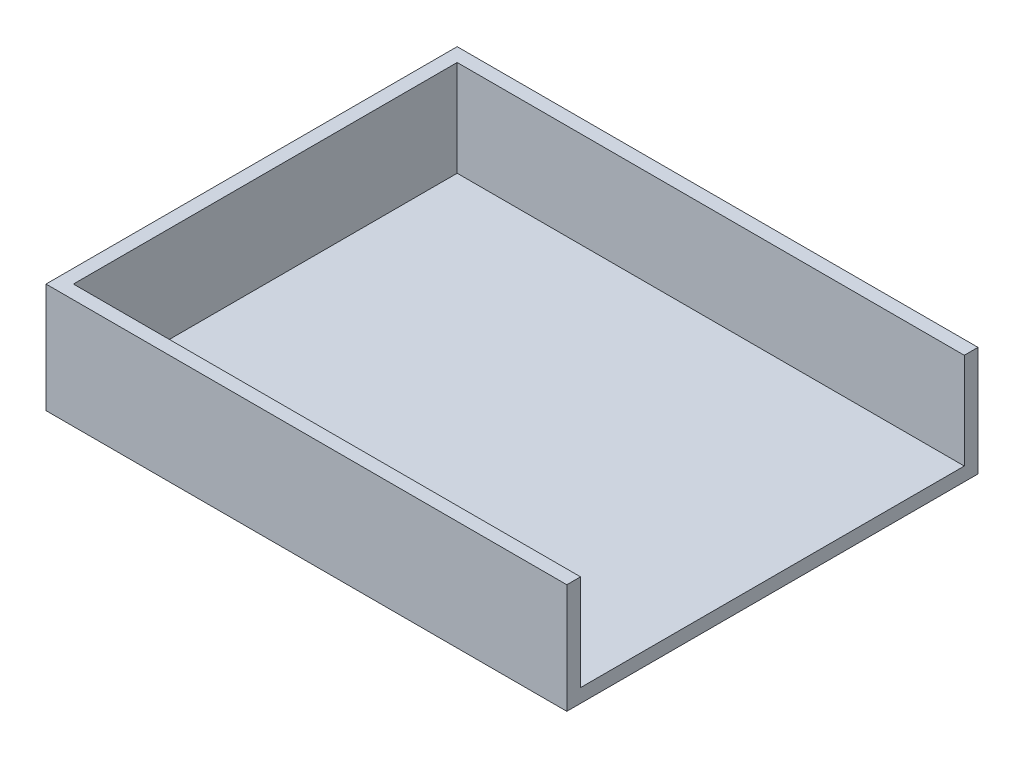
ISO-10303-21;
HEADER;
FILE_DESCRIPTION(('STEP AP214'),'2;1');
FILE_NAME('part.step','',(''),(''),'','','');
FILE_SCHEMA(('AUTOMOTIVE_DESIGN { 1 0 10303 214 1 1 1 1 }'));
ENDSEC;
DATA;
#1=APPLICATION_CONTEXT('core data for automotive mechanical design processes');
#2=APPLICATION_PROTOCOL_DEFINITION('international standard','automotive_design',2000,#1);
#3=PRODUCT_CONTEXT('',#1,'mechanical');
#4=PRODUCT('Part','Part','',(#3));
#5=PRODUCT_RELATED_PRODUCT_CATEGORY('part','',(#4));
#6=PRODUCT_DEFINITION_FORMATION('','',#4);
#7=PRODUCT_DEFINITION_CONTEXT('part definition',#1,'design');
#8=PRODUCT_DEFINITION('design','',#6,#7);
#9=PRODUCT_DEFINITION_SHAPE('','',#8);
#10=(LENGTH_UNIT() NAMED_UNIT(*) SI_UNIT(.MILLI.,.METRE.));
#11=(NAMED_UNIT(*) PLANE_ANGLE_UNIT() SI_UNIT($,.RADIAN.));
#12=(NAMED_UNIT(*) SI_UNIT($,.STERADIAN.) SOLID_ANGLE_UNIT());
#13=UNCERTAINTY_MEASURE_WITH_UNIT(LENGTH_MEASURE(1.E-05),#10,'distance_accuracy_value','');
#14=(GEOMETRIC_REPRESENTATION_CONTEXT(3) GLOBAL_UNCERTAINTY_ASSIGNED_CONTEXT((#13)) GLOBAL_UNIT_ASSIGNED_CONTEXT((#10,
#11,#12)) REPRESENTATION_CONTEXT('',''));
#15=CARTESIAN_POINT('',(0.,0.,0.));
#16=DIRECTION('',(0.,0.,1.));
#17=DIRECTION('',(1.,0.,0.));
#18=AXIS2_PLACEMENT_3D('',#15,#16,#17);
#19=CARTESIAN_POINT('',(19.,8.,15.));
#20=DIRECTION('',(-1.,0.,0.));
#21=DIRECTION('',(0.,0.,1.));
#22=AXIS2_PLACEMENT_3D('',#19,#20,#21);
#23=PLANE('',#22);
#24=DIRECTION('',(0.,-1.,0.));
#25=VECTOR('',#24,1.);
#26=CARTESIAN_POINT('',(19.,8.,14.));
#27=LINE('',#26,#25);
#28=CARTESIAN_POINT('',(19.,8.,14.));
#29=VERTEX_POINT('',#28);
#30=CARTESIAN_POINT('',(19.,1.,14.));
#31=VERTEX_POINT('',#30);
#32=EDGE_CURVE('E127',#29,#31,#27,.T.);
#33=ORIENTED_EDGE('',*,*,#32,.F.);
#34=DIRECTION('',(0.,0.,-1.));
#35=VECTOR('',#34,1.);
#36=CARTESIAN_POINT('',(19.,8.,15.));
#37=LINE('',#36,#35);
#38=CARTESIAN_POINT('',(19.,8.,15.));
#39=VERTEX_POINT('',#38);
#40=EDGE_CURVE('E132',#39,#29,#37,.T.);
#41=ORIENTED_EDGE('',*,*,#40,.F.);
#42=DIRECTION('',(0.,-1.,0.));
#43=VECTOR('',#42,1.);
#44=CARTESIAN_POINT('',(19.,8.,15.));
#45=LINE('',#44,#43);
#46=CARTESIAN_POINT('',(19.,0.,15.));
#47=VERTEX_POINT('',#46);
#48=EDGE_CURVE('E41',#39,#47,#45,.T.);
#49=ORIENTED_EDGE('',*,*,#48,.T.);
#50=DIRECTION('',(0.,0.,-1.));
#51=VECTOR('',#50,1.);
#52=CARTESIAN_POINT('',(19.,0.,15.));
#53=LINE('',#52,#51);
#54=CARTESIAN_POINT('',(19.,0.,-15.));
#55=VERTEX_POINT('',#54);
#56=EDGE_CURVE('E157',#47,#55,#53,.T.);
#57=ORIENTED_EDGE('',*,*,#56,.T.);
#58=DIRECTION('',(0.,-1.,0.));
#59=VECTOR('',#58,1.);
#60=CARTESIAN_POINT('',(19.,8.,-15.));
#61=LINE('',#60,#59);
#62=CARTESIAN_POINT('',(19.,8.,-15.));
#63=VERTEX_POINT('',#62);
#64=EDGE_CURVE('E161',#63,#55,#61,.T.);
#65=ORIENTED_EDGE('',*,*,#64,.F.);
#66=CARTESIAN_POINT('',(19.,8.,-14.));
#67=VERTEX_POINT('',#66);
#68=EDGE_CURVE('E149',#67,#63,#37,.T.);
#69=ORIENTED_EDGE('',*,*,#68,.F.);
#70=DIRECTION('',(0.,-1.,0.));
#71=VECTOR('',#70,1.);
#72=CARTESIAN_POINT('',(19.,8.,-14.));
#73=LINE('',#72,#71);
#74=CARTESIAN_POINT('',(19.,1.,-14.));
#75=VERTEX_POINT('',#74);
#76=EDGE_CURVE('E48',#67,#75,#73,.T.);
#77=ORIENTED_EDGE('',*,*,#76,.T.);
#78=DIRECTION('',(0.,0.,-1.));
#79=VECTOR('',#78,1.);
#80=CARTESIAN_POINT('',(19.,1.,-14.));
#81=LINE('',#80,#79);
#82=EDGE_CURVE('E140',#31,#75,#81,.T.);
#83=ORIENTED_EDGE('',*,*,#82,.F.);
#84=EDGE_LOOP('',(#33,#41,#49,#57,#65,#69,#77,#83));
#85=FACE_BOUND('',#84,.T.);
#86=ADVANCED_FACE('F33',(#85),#23,.F.);
#87=CARTESIAN_POINT('',(0.,8.,0.));
#88=DIRECTION('',(0.,1.,0.));
#89=DIRECTION('',(0.,0.,1.));
#90=AXIS2_PLACEMENT_3D('',#87,#88,#89);
#91=PLANE('',#90);
#92=ORIENTED_EDGE('',*,*,#40,.T.);
#93=DIRECTION('',(1.,0.,0.));
#94=VECTOR('',#93,1.);
#95=CARTESIAN_POINT('',(-18.,8.,14.));
#96=LINE('',#95,#94);
#97=CARTESIAN_POINT('',(-18.,8.,14.));
#98=VERTEX_POINT('',#97);
#99=EDGE_CURVE('E118',#98,#29,#96,.T.);
#100=ORIENTED_EDGE('',*,*,#99,.F.);
#101=DIRECTION('',(0.,0.,1.));
#102=VECTOR('',#101,1.);
#103=CARTESIAN_POINT('',(-18.,8.,-14.));
#104=LINE('',#103,#102);
#105=CARTESIAN_POINT('',(-18.,8.,-14.));
#106=VERTEX_POINT('',#105);
#107=EDGE_CURVE('E109',#106,#98,#104,.T.);
#108=ORIENTED_EDGE('',*,*,#107,.F.);
#109=DIRECTION('',(-1.,0.,0.));
#110=VECTOR('',#109,1.);
#111=CARTESIAN_POINT('',(-18.,8.,-14.));
#112=LINE('',#111,#110);
#113=EDGE_CURVE('E133',#67,#106,#112,.T.);
#114=ORIENTED_EDGE('',*,*,#113,.F.);
#115=ORIENTED_EDGE('',*,*,#68,.T.);
#116=DIRECTION('',(-1.,0.,0.));
#117=VECTOR('',#116,1.);
#118=CARTESIAN_POINT('',(19.,8.,-15.));
#119=LINE('',#118,#117);
#120=CARTESIAN_POINT('',(-19.,8.,-15.));
#121=VERTEX_POINT('',#120);
#122=EDGE_CURVE('E57',#63,#121,#119,.T.);
#123=ORIENTED_EDGE('',*,*,#122,.T.);
#124=DIRECTION('',(0.,0.,1.));
#125=VECTOR('',#124,1.);
#126=CARTESIAN_POINT('',(-19.,8.,15.));
#127=LINE('',#126,#125);
#128=CARTESIAN_POINT('',(-19.,8.,15.));
#129=VERTEX_POINT('',#128);
#130=EDGE_CURVE('E146',#121,#129,#127,.T.);
#131=ORIENTED_EDGE('',*,*,#130,.T.);
#132=DIRECTION('',(1.,0.,0.));
#133=VECTOR('',#132,1.);
#134=CARTESIAN_POINT('',(19.,8.,15.));
#135=LINE('',#134,#133);
#136=EDGE_CURVE('E85',#129,#39,#135,.T.);
#137=ORIENTED_EDGE('',*,*,#136,.T.);
#138=EDGE_LOOP('',(#92,#100,#108,#114,#115,#123,#131,#137));
#139=FACE_BOUND('',#138,.T.);
#140=ADVANCED_FACE('F130',(#139),#91,.T.);
#141=CARTESIAN_POINT('',(-19.,8.,15.));
#142=DIRECTION('',(1.,0.,0.));
#143=DIRECTION('',(0.,0.,-1.));
#144=AXIS2_PLACEMENT_3D('',#141,#142,#143);
#145=PLANE('',#144);
#146=DIRECTION('',(0.,0.,1.));
#147=VECTOR('',#146,1.);
#148=CARTESIAN_POINT('',(-19.,0.,15.));
#149=LINE('',#148,#147);
#150=CARTESIAN_POINT('',(-19.,0.,-15.));
#151=VERTEX_POINT('',#150);
#152=CARTESIAN_POINT('',(-19.,0.,15.));
#153=VERTEX_POINT('',#152);
#154=EDGE_CURVE('E126',#151,#153,#149,.T.);
#155=ORIENTED_EDGE('',*,*,#154,.T.);
#156=DIRECTION('',(0.,-1.,0.));
#157=VECTOR('',#156,1.);
#158=CARTESIAN_POINT('',(-19.,8.,15.));
#159=LINE('',#158,#157);
#160=EDGE_CURVE('E11',#129,#153,#159,.T.);
#161=ORIENTED_EDGE('',*,*,#160,.F.);
#162=ORIENTED_EDGE('',*,*,#130,.F.);
#163=DIRECTION('',(0.,-1.,0.));
#164=VECTOR('',#163,1.);
#165=CARTESIAN_POINT('',(-19.,8.,-15.));
#166=LINE('',#165,#164);
#167=EDGE_CURVE('E152',#121,#151,#166,.T.);
#168=ORIENTED_EDGE('',*,*,#167,.T.);
#169=EDGE_LOOP('',(#155,#161,#162,#168));
#170=FACE_BOUND('',#169,.T.);
#171=ADVANCED_FACE('F35',(#170),#145,.F.);
#172=CARTESIAN_POINT('',(19.,8.,15.));
#173=DIRECTION('',(0.,0.,-1.));
#174=DIRECTION('',(-1.,0.,0.));
#175=AXIS2_PLACEMENT_3D('',#172,#173,#174);
#176=PLANE('',#175);
#177=DIRECTION('',(1.,0.,0.));
#178=VECTOR('',#177,1.);
#179=CARTESIAN_POINT('',(19.,0.,15.));
#180=LINE('',#179,#178);
#181=EDGE_CURVE('E155',#153,#47,#180,.T.);
#182=ORIENTED_EDGE('',*,*,#181,.T.);
#183=ORIENTED_EDGE('',*,*,#48,.F.);
#184=ORIENTED_EDGE('',*,*,#136,.F.);
#185=ORIENTED_EDGE('',*,*,#160,.T.);
#186=EDGE_LOOP('',(#182,#183,#184,#185));
#187=FACE_BOUND('',#186,.T.);
#188=ADVANCED_FACE('F192',(#187),#176,.F.);
#189=CARTESIAN_POINT('',(19.,8.,-15.));
#190=DIRECTION('',(0.,0.,1.));
#191=DIRECTION('',(1.,0.,0.));
#192=AXIS2_PLACEMENT_3D('',#189,#190,#191);
#193=PLANE('',#192);
#194=DIRECTION('',(-1.,0.,0.));
#195=VECTOR('',#194,1.);
#196=CARTESIAN_POINT('',(19.,0.,-15.));
#197=LINE('',#196,#195);
#198=EDGE_CURVE('E78',#55,#151,#197,.T.);
#199=ORIENTED_EDGE('',*,*,#198,.T.);
#200=ORIENTED_EDGE('',*,*,#167,.F.);
#201=ORIENTED_EDGE('',*,*,#122,.F.);
#202=ORIENTED_EDGE('',*,*,#64,.T.);
#203=EDGE_LOOP('',(#199,#200,#201,#202));
#204=FACE_BOUND('',#203,.T.);
#205=ADVANCED_FACE('F172',(#204),#193,.F.);
#206=CARTESIAN_POINT('',(0.,0.,0.));
#207=DIRECTION('',(0.,1.,0.));
#208=DIRECTION('',(0.,0.,1.));
#209=AXIS2_PLACEMENT_3D('',#206,#207,#208);
#210=PLANE('',#209);
#211=ORIENTED_EDGE('',*,*,#154,.F.);
#212=ORIENTED_EDGE('',*,*,#198,.F.);
#213=ORIENTED_EDGE('',*,*,#56,.F.);
#214=ORIENTED_EDGE('',*,*,#181,.F.);
#215=EDGE_LOOP('',(#211,#212,#213,#214));
#216=FACE_BOUND('',#215,.T.);
#217=ADVANCED_FACE('F168',(#216),#210,.F.);
#218=CARTESIAN_POINT('',(-18.,8.,-14.));
#219=DIRECTION('',(1.,0.,0.));
#220=DIRECTION('',(0.,0.,-1.));
#221=AXIS2_PLACEMENT_3D('',#218,#219,#220);
#222=PLANE('',#221);
#223=DIRECTION('',(0.,0.,1.));
#224=VECTOR('',#223,1.);
#225=CARTESIAN_POINT('',(-18.,1.,-14.));
#226=LINE('',#225,#224);
#227=CARTESIAN_POINT('',(-18.,1.,-14.));
#228=VERTEX_POINT('',#227);
#229=CARTESIAN_POINT('',(-18.,1.,14.));
#230=VERTEX_POINT('',#229);
#231=EDGE_CURVE('E137',#228,#230,#226,.T.);
#232=ORIENTED_EDGE('',*,*,#231,.F.);
#233=DIRECTION('',(0.,-1.,0.));
#234=VECTOR('',#233,1.);
#235=CARTESIAN_POINT('',(-18.,8.,-14.));
#236=LINE('',#235,#234);
#237=EDGE_CURVE('E116',#106,#228,#236,.T.);
#238=ORIENTED_EDGE('',*,*,#237,.F.);
#239=ORIENTED_EDGE('',*,*,#107,.T.);
#240=DIRECTION('',(0.,-1.,0.));
#241=VECTOR('',#240,1.);
#242=CARTESIAN_POINT('',(-18.,8.,14.));
#243=LINE('',#242,#241);
#244=EDGE_CURVE('E113',#98,#230,#243,.T.);
#245=ORIENTED_EDGE('',*,*,#244,.T.);
#246=EDGE_LOOP('',(#232,#238,#239,#245));
#247=FACE_BOUND('',#246,.T.);
#248=ADVANCED_FACE('F112',(#247),#222,.T.);
#249=CARTESIAN_POINT('',(-18.,8.,14.));
#250=DIRECTION('',(0.,0.,-1.));
#251=DIRECTION('',(-1.,0.,0.));
#252=AXIS2_PLACEMENT_3D('',#249,#250,#251);
#253=PLANE('',#252);
#254=DIRECTION('',(1.,0.,0.));
#255=VECTOR('',#254,1.);
#256=CARTESIAN_POINT('',(-18.,1.,14.));
#257=LINE('',#256,#255);
#258=EDGE_CURVE('E125',#230,#31,#257,.T.);
#259=ORIENTED_EDGE('',*,*,#258,.F.);
#260=ORIENTED_EDGE('',*,*,#244,.F.);
#261=ORIENTED_EDGE('',*,*,#99,.T.);
#262=ORIENTED_EDGE('',*,*,#32,.T.);
#263=EDGE_LOOP('',(#259,#260,#261,#262));
#264=FACE_BOUND('',#263,.T.);
#265=ADVANCED_FACE('F122',(#264),#253,.T.);
#266=CARTESIAN_POINT('',(-18.,8.,-14.));
#267=DIRECTION('',(0.,0.,1.));
#268=DIRECTION('',(1.,0.,0.));
#269=AXIS2_PLACEMENT_3D('',#266,#267,#268);
#270=PLANE('',#269);
#271=DIRECTION('',(-1.,0.,0.));
#272=VECTOR('',#271,1.);
#273=CARTESIAN_POINT('',(-18.,1.,-14.));
#274=LINE('',#273,#272);
#275=EDGE_CURVE('E119',#75,#228,#274,.T.);
#276=ORIENTED_EDGE('',*,*,#275,.F.);
#277=ORIENTED_EDGE('',*,*,#76,.F.);
#278=ORIENTED_EDGE('',*,*,#113,.T.);
#279=ORIENTED_EDGE('',*,*,#237,.T.);
#280=EDGE_LOOP('',(#276,#277,#278,#279));
#281=FACE_BOUND('',#280,.T.);
#282=ADVANCED_FACE('F175',(#281),#270,.T.);
#283=CARTESIAN_POINT('',(0.,1.,0.));
#284=DIRECTION('',(0.,1.,0.));
#285=DIRECTION('',(0.,0.,1.));
#286=AXIS2_PLACEMENT_3D('',#283,#284,#285);
#287=PLANE('',#286);
#288=ORIENTED_EDGE('',*,*,#231,.T.);
#289=ORIENTED_EDGE('',*,*,#258,.T.);
#290=ORIENTED_EDGE('',*,*,#82,.T.);
#291=ORIENTED_EDGE('',*,*,#275,.T.);
#292=EDGE_LOOP('',(#288,#289,#290,#291));
#293=FACE_BOUND('',#292,.T.);
#294=ADVANCED_FACE('F177',(#293),#287,.T.);
#295=CLOSED_SHELL('',(#86,#140,#171,#188,#205,#217,#248,#265,#282,#294));
#296=MANIFOLD_SOLID_BREP('B2',#295);
#297=ADVANCED_BREP_SHAPE_REPRESENTATION('',(#18,#296),#14);
#298=SHAPE_DEFINITION_REPRESENTATION(#9,#297);
ENDSEC;
END-ISO-10303-21;
